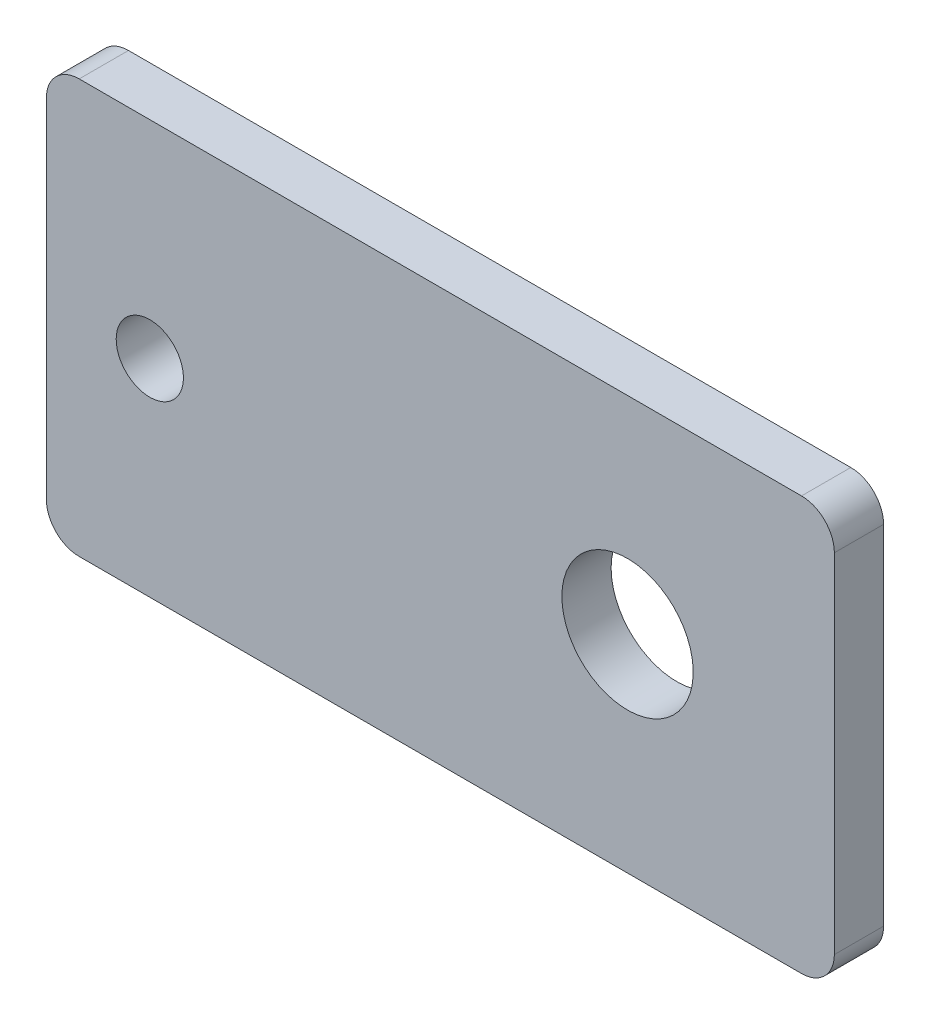
ISO-10303-21;
HEADER;
FILE_DESCRIPTION(('STEP AP214'),'2;1');
FILE_NAME('part.step','',(''),(''),'','','');
FILE_SCHEMA(('AUTOMOTIVE_DESIGN { 1 0 10303 214 1 1 1 1 }'));
ENDSEC;
DATA;
#1=APPLICATION_CONTEXT('core data for automotive mechanical design processes');
#2=APPLICATION_PROTOCOL_DEFINITION('international standard','automotive_design',2000,#1);
#3=PRODUCT_CONTEXT('',#1,'mechanical');
#4=PRODUCT('Part','Part','',(#3));
#5=PRODUCT_RELATED_PRODUCT_CATEGORY('part','',(#4));
#6=PRODUCT_DEFINITION_FORMATION('','',#4);
#7=PRODUCT_DEFINITION_CONTEXT('part definition',#1,'design');
#8=PRODUCT_DEFINITION('design','',#6,#7);
#9=PRODUCT_DEFINITION_SHAPE('','',#8);
#10=(LENGTH_UNIT() NAMED_UNIT(*) SI_UNIT(.MILLI.,.METRE.));
#11=(NAMED_UNIT(*) PLANE_ANGLE_UNIT() SI_UNIT($,.RADIAN.));
#12=(NAMED_UNIT(*) SI_UNIT($,.STERADIAN.) SOLID_ANGLE_UNIT());
#13=UNCERTAINTY_MEASURE_WITH_UNIT(LENGTH_MEASURE(1.E-05),#10,'distance_accuracy_value','');
#14=(GEOMETRIC_REPRESENTATION_CONTEXT(3) GLOBAL_UNCERTAINTY_ASSIGNED_CONTEXT((#13)) GLOBAL_UNIT_ASSIGNED_CONTEXT((#10,
#11,#12)) REPRESENTATION_CONTEXT('',''));
#15=CARTESIAN_POINT('',(0.,0.,0.));
#16=DIRECTION('',(0.,0.,1.));
#17=DIRECTION('',(1.,0.,0.));
#18=AXIS2_PLACEMENT_3D('',#15,#16,#17);
#19=CARTESIAN_POINT('',(0.,0.,4.7625));
#20=DIRECTION('',(0.,0.,1.));
#21=DIRECTION('',(1.,0.,0.));
#22=AXIS2_PLACEMENT_3D('',#19,#20,#21);
#23=PLANE('',#22);
#24=CARTESIAN_POINT('',(221.749963424788,-18.1000253637566,4.7625));
#25=DIRECTION('',(0.,0.,1.));
#26=DIRECTION('',(1.,0.,0.));
#27=AXIS2_PLACEMENT_3D('',#24,#25,#26);
#28=CIRCLE('',#27,6.35);
#29=CARTESIAN_POINT('',(215.399963424788,-18.1000253637566,4.7625));
#30=VERTEX_POINT('',#29);
#31=EDGE_CURVE('E174',#30,#30,#28,.T.);
#32=ORIENTED_EDGE('',*,*,#31,.F.);
#33=EDGE_LOOP('',(#32));
#34=FACE_BOUND('',#33,.T.);
#35=DIRECTION('',(-1.,0.,0.));
#36=VECTOR('',#35,1.);
#37=CARTESIAN_POINT('',(241.749963424788,1.89997463624341,4.7625));
#38=LINE('',#37,#36);
#39=CARTESIAN_POINT('',(238.574963424788,1.89997463624341,4.7625));
#40=VERTEX_POINT('',#39);
#41=CARTESIAN_POINT('',(168.724963424788,1.8999746362434,4.7625));
#42=VERTEX_POINT('',#41);
#43=EDGE_CURVE('E169',#40,#42,#38,.T.);
#44=ORIENTED_EDGE('',*,*,#43,.T.);
#45=CARTESIAN_POINT('',(168.724963424788,-1.2750253637566,4.7625));
#46=DIRECTION('',(0.,0.,1.));
#47=DIRECTION('',(1.,0.,0.));
#48=AXIS2_PLACEMENT_3D('',#45,#46,#47);
#49=CIRCLE('',#48,3.175);
#50=CARTESIAN_POINT('',(165.549963424788,-1.2750253637566,4.7625));
#51=VERTEX_POINT('',#50);
#52=EDGE_CURVE('E150',#42,#51,#49,.T.);
#53=ORIENTED_EDGE('',*,*,#52,.T.);
#54=DIRECTION('',(0.,-1.,0.));
#55=VECTOR('',#54,1.);
#56=CARTESIAN_POINT('',(165.549963424788,-38.1000253637566,4.7625));
#57=LINE('',#56,#55);
#58=CARTESIAN_POINT('',(165.549963424788,-34.9250253637566,4.7625));
#59=VERTEX_POINT('',#58);
#60=EDGE_CURVE('E120',#51,#59,#57,.T.);
#61=ORIENTED_EDGE('',*,*,#60,.T.);
#62=CARTESIAN_POINT('',(168.724963424788,-34.9250253637566,4.7625));
#63=DIRECTION('',(0.,0.,1.));
#64=DIRECTION('',(1.,0.,0.));
#65=AXIS2_PLACEMENT_3D('',#62,#63,#64);
#66=CIRCLE('',#65,3.175);
#67=CARTESIAN_POINT('',(168.724963424788,-38.1000253637566,4.7625));
#68=VERTEX_POINT('',#67);
#69=EDGE_CURVE('E56',#59,#68,#66,.T.);
#70=ORIENTED_EDGE('',*,*,#69,.T.);
#71=DIRECTION('',(1.,0.,0.));
#72=VECTOR('',#71,1.);
#73=CARTESIAN_POINT('',(241.749963424788,-38.1000253637566,4.7625));
#74=LINE('',#73,#72);
#75=CARTESIAN_POINT('',(238.574963424788,-38.1000253637566,4.7625));
#76=VERTEX_POINT('',#75);
#77=EDGE_CURVE('E136',#68,#76,#74,.T.);
#78=ORIENTED_EDGE('',*,*,#77,.T.);
#79=CARTESIAN_POINT('',(238.574963424788,-34.9250253637566,4.7625));
#80=DIRECTION('',(0.,0.,1.));
#81=DIRECTION('',(1.,0.,0.));
#82=AXIS2_PLACEMENT_3D('',#79,#80,#81);
#83=CIRCLE('',#82,3.175);
#84=CARTESIAN_POINT('',(241.749963424788,-34.9250253637566,4.7625));
#85=VERTEX_POINT('',#84);
#86=EDGE_CURVE('E147',#76,#85,#83,.T.);
#87=ORIENTED_EDGE('',*,*,#86,.T.);
#88=DIRECTION('',(0.,1.,0.));
#89=VECTOR('',#88,1.);
#90=CARTESIAN_POINT('',(241.749963424788,-38.1000253637566,4.7625));
#91=LINE('',#90,#89);
#92=CARTESIAN_POINT('',(241.749963424788,-1.27502536375659,4.7625));
#93=VERTEX_POINT('',#92);
#94=EDGE_CURVE('E130',#85,#93,#91,.T.);
#95=ORIENTED_EDGE('',*,*,#94,.T.);
#96=CARTESIAN_POINT('',(238.574963424788,-1.27502536375659,4.7625));
#97=DIRECTION('',(0.,0.,1.));
#98=DIRECTION('',(1.,0.,0.));
#99=AXIS2_PLACEMENT_3D('',#96,#97,#98);
#100=CIRCLE('',#99,3.175);
#101=EDGE_CURVE('E145',#93,#40,#100,.T.);
#102=ORIENTED_EDGE('',*,*,#101,.T.);
#103=EDGE_LOOP('',(#44,#53,#61,#70,#78,#87,#95,#102));
#104=FACE_BOUND('',#103,.T.);
#105=CARTESIAN_POINT('',(175.549963424788,-18.1000253637566,4.7625));
#106=DIRECTION('',(0.,0.,1.));
#107=DIRECTION('',(1.,0.,0.));
#108=AXIS2_PLACEMENT_3D('',#105,#106,#107);
#109=CIRCLE('',#108,3.25000000000001);
#110=CARTESIAN_POINT('',(172.299963424788,-18.1000253637566,4.7625));
#111=VERTEX_POINT('',#110);
#112=EDGE_CURVE('E183',#111,#111,#109,.T.);
#113=ORIENTED_EDGE('',*,*,#112,.F.);
#114=EDGE_LOOP('',(#113));
#115=FACE_BOUND('',#114,.T.);
#116=ADVANCED_FACE('F34',(#34,#104,#115),#23,.T.);
#117=CARTESIAN_POINT('',(0.,0.,0.));
#118=DIRECTION('',(0.,0.,1.));
#119=DIRECTION('',(1.,0.,0.));
#120=AXIS2_PLACEMENT_3D('',#117,#118,#119);
#121=PLANE('',#120);
#122=CARTESIAN_POINT('',(221.749963424788,-18.1000253637566,0.));
#123=DIRECTION('',(0.,0.,1.));
#124=DIRECTION('',(1.,0.,0.));
#125=AXIS2_PLACEMENT_3D('',#122,#123,#124);
#126=CIRCLE('',#125,6.35);
#127=CARTESIAN_POINT('',(215.399963424788,-18.1000253637566,0.));
#128=VERTEX_POINT('',#127);
#129=EDGE_CURVE('E176',#128,#128,#126,.T.);
#130=ORIENTED_EDGE('',*,*,#129,.T.);
#131=EDGE_LOOP('',(#130));
#132=FACE_BOUND('',#131,.T.);
#133=DIRECTION('',(0.,-1.,0.));
#134=VECTOR('',#133,1.);
#135=CARTESIAN_POINT('',(165.549963424788,-38.1000253637566,0.));
#136=LINE('',#135,#134);
#137=CARTESIAN_POINT('',(165.549963424788,-1.2750253637566,0.));
#138=VERTEX_POINT('',#137);
#139=CARTESIAN_POINT('',(165.549963424788,-34.9250253637566,0.));
#140=VERTEX_POINT('',#139);
#141=EDGE_CURVE('E118',#138,#140,#136,.T.);
#142=ORIENTED_EDGE('',*,*,#141,.F.);
#143=CARTESIAN_POINT('',(168.724963424788,-1.2750253637566,0.));
#144=DIRECTION('',(0.,0.,1.));
#145=DIRECTION('',(1.,0.,0.));
#146=AXIS2_PLACEMENT_3D('',#143,#144,#145);
#147=CIRCLE('',#146,3.175);
#148=CARTESIAN_POINT('',(168.724963424788,1.8999746362434,0.));
#149=VERTEX_POINT('',#148);
#150=EDGE_CURVE('E101',#138,#149,#147,.F.);
#151=ORIENTED_EDGE('',*,*,#150,.T.);
#152=DIRECTION('',(-1.,0.,0.));
#153=VECTOR('',#152,1.);
#154=CARTESIAN_POINT('',(241.749963424788,1.89997463624341,0.));
#155=LINE('',#154,#153);
#156=CARTESIAN_POINT('',(238.574963424788,1.89997463624341,0.));
#157=VERTEX_POINT('',#156);
#158=EDGE_CURVE('E128',#157,#149,#155,.T.);
#159=ORIENTED_EDGE('',*,*,#158,.F.);
#160=CARTESIAN_POINT('',(238.574963424788,-1.27502536375659,0.));
#161=DIRECTION('',(0.,0.,1.));
#162=DIRECTION('',(1.,0.,0.));
#163=AXIS2_PLACEMENT_3D('',#160,#161,#162);
#164=CIRCLE('',#163,3.175);
#165=CARTESIAN_POINT('',(241.749963424788,-1.27502536375659,0.));
#166=VERTEX_POINT('',#165);
#167=EDGE_CURVE('E121',#157,#166,#164,.F.);
#168=ORIENTED_EDGE('',*,*,#167,.T.);
#169=DIRECTION('',(0.,1.,0.));
#170=VECTOR('',#169,1.);
#171=CARTESIAN_POINT('',(241.749963424788,-38.1000253637566,0.));
#172=LINE('',#171,#170);
#173=CARTESIAN_POINT('',(241.749963424788,-34.9250253637566,0.));
#174=VERTEX_POINT('',#173);
#175=EDGE_CURVE('E132',#174,#166,#172,.T.);
#176=ORIENTED_EDGE('',*,*,#175,.F.);
#177=CARTESIAN_POINT('',(238.574963424788,-34.9250253637566,0.));
#178=DIRECTION('',(0.,0.,1.));
#179=DIRECTION('',(1.,0.,0.));
#180=AXIS2_PLACEMENT_3D('',#177,#178,#179);
#181=CIRCLE('',#180,3.175);
#182=CARTESIAN_POINT('',(238.574963424788,-38.1000253637566,0.));
#183=VERTEX_POINT('',#182);
#184=EDGE_CURVE('E139',#174,#183,#181,.F.);
#185=ORIENTED_EDGE('',*,*,#184,.T.);
#186=DIRECTION('',(1.,0.,0.));
#187=VECTOR('',#186,1.);
#188=CARTESIAN_POINT('',(241.749963424788,-38.1000253637566,0.));
#189=LINE('',#188,#187);
#190=CARTESIAN_POINT('',(168.724963424788,-38.1000253637566,0.));
#191=VERTEX_POINT('',#190);
#192=EDGE_CURVE('E127',#191,#183,#189,.T.);
#193=ORIENTED_EDGE('',*,*,#192,.F.);
#194=CARTESIAN_POINT('',(168.724963424788,-34.9250253637566,0.));
#195=DIRECTION('',(0.,0.,1.));
#196=DIRECTION('',(1.,0.,0.));
#197=AXIS2_PLACEMENT_3D('',#194,#195,#196);
#198=CIRCLE('',#197,3.175);
#199=EDGE_CURVE('E112',#191,#140,#198,.F.);
#200=ORIENTED_EDGE('',*,*,#199,.T.);
#201=EDGE_LOOP('',(#142,#151,#159,#168,#176,#185,#193,#200));
#202=FACE_BOUND('',#201,.T.);
#203=CARTESIAN_POINT('',(175.549963424788,-18.1000253637566,0.));
#204=DIRECTION('',(0.,0.,1.));
#205=DIRECTION('',(1.,0.,0.));
#206=AXIS2_PLACEMENT_3D('',#203,#204,#205);
#207=CIRCLE('',#206,3.25000000000001);
#208=CARTESIAN_POINT('',(172.299963424788,-18.1000253637566,0.));
#209=VERTEX_POINT('',#208);
#210=EDGE_CURVE('E185',#209,#209,#207,.T.);
#211=ORIENTED_EDGE('',*,*,#210,.T.);
#212=EDGE_LOOP('',(#211));
#213=FACE_BOUND('',#212,.T.);
#214=ADVANCED_FACE('F124',(#132,#202,#213),#121,.F.);
#215=CARTESIAN_POINT('',(241.749963424788,-38.1000253637566,4.7625));
#216=DIRECTION('',(-1.,0.,0.));
#217=DIRECTION('',(0.,0.,1.));
#218=AXIS2_PLACEMENT_3D('',#215,#216,#217);
#219=PLANE('',#218);
#220=ORIENTED_EDGE('',*,*,#94,.F.);
#221=DIRECTION('',(0.,0.,-1.));
#222=VECTOR('',#221,1.);
#223=CARTESIAN_POINT('',(241.749963424788,-34.9250253637566,4.7625));
#224=LINE('',#223,#222);
#225=EDGE_CURVE('E11',#85,#174,#224,.T.);
#226=ORIENTED_EDGE('',*,*,#225,.T.);
#227=ORIENTED_EDGE('',*,*,#175,.T.);
#228=DIRECTION('',(0.,0.,-1.));
#229=VECTOR('',#228,1.);
#230=CARTESIAN_POINT('',(241.749963424788,-1.27502536375659,4.7625));
#231=LINE('',#230,#229);
#232=EDGE_CURVE('E42',#166,#93,#231,.F.);
#233=ORIENTED_EDGE('',*,*,#232,.T.);
#234=EDGE_LOOP('',(#220,#226,#227,#233));
#235=FACE_BOUND('',#234,.T.);
#236=ADVANCED_FACE('F160',(#235),#219,.F.);
#237=CARTESIAN_POINT('',(241.749963424788,1.89997463624341,4.7625));
#238=DIRECTION('',(0.,-1.,0.));
#239=DIRECTION('',(1.,0.,0.));
#240=AXIS2_PLACEMENT_3D('',#237,#238,#239);
#241=PLANE('',#240);
#242=ORIENTED_EDGE('',*,*,#158,.T.);
#243=DIRECTION('',(0.,0.,-1.));
#244=VECTOR('',#243,1.);
#245=CARTESIAN_POINT('',(168.724963424788,1.8999746362434,4.7625));
#246=LINE('',#245,#244);
#247=EDGE_CURVE('E106',#149,#42,#246,.F.);
#248=ORIENTED_EDGE('',*,*,#247,.T.);
#249=ORIENTED_EDGE('',*,*,#43,.F.);
#250=DIRECTION('',(0.,0.,-1.));
#251=VECTOR('',#250,1.);
#252=CARTESIAN_POINT('',(238.574963424788,1.89997463624341,4.7625));
#253=LINE('',#252,#251);
#254=EDGE_CURVE('E111',#40,#157,#253,.T.);
#255=ORIENTED_EDGE('',*,*,#254,.T.);
#256=EDGE_LOOP('',(#242,#248,#249,#255));
#257=FACE_BOUND('',#256,.T.);
#258=ADVANCED_FACE('F173',(#257),#241,.F.);
#259=CARTESIAN_POINT('',(165.549963424788,-38.1000253637566,4.7625));
#260=DIRECTION('',(1.,0.,0.));
#261=DIRECTION('',(0.,0.,-1.));
#262=AXIS2_PLACEMENT_3D('',#259,#260,#261);
#263=PLANE('',#262);
#264=ORIENTED_EDGE('',*,*,#60,.F.);
#265=DIRECTION('',(0.,0.,-1.));
#266=VECTOR('',#265,1.);
#267=CARTESIAN_POINT('',(165.549963424788,-1.2750253637566,4.7625));
#268=LINE('',#267,#266);
#269=EDGE_CURVE('E105',#51,#138,#268,.T.);
#270=ORIENTED_EDGE('',*,*,#269,.T.);
#271=ORIENTED_EDGE('',*,*,#141,.T.);
#272=DIRECTION('',(0.,0.,-1.));
#273=VECTOR('',#272,1.);
#274=CARTESIAN_POINT('',(165.549963424788,-34.9250253637566,4.7625));
#275=LINE('',#274,#273);
#276=EDGE_CURVE('E122',#140,#59,#275,.F.);
#277=ORIENTED_EDGE('',*,*,#276,.T.);
#278=EDGE_LOOP('',(#264,#270,#271,#277));
#279=FACE_BOUND('',#278,.T.);
#280=ADVANCED_FACE('F117',(#279),#263,.F.);
#281=CARTESIAN_POINT('',(241.749963424788,-38.1000253637566,4.7625));
#282=DIRECTION('',(0.,1.,0.));
#283=DIRECTION('',(-1.,0.,0.));
#284=AXIS2_PLACEMENT_3D('',#281,#282,#283);
#285=PLANE('',#284);
#286=ORIENTED_EDGE('',*,*,#77,.F.);
#287=DIRECTION('',(0.,0.,-1.));
#288=VECTOR('',#287,1.);
#289=CARTESIAN_POINT('',(168.724963424788,-38.1000253637566,4.7625));
#290=LINE('',#289,#288);
#291=EDGE_CURVE('E153',#68,#191,#290,.T.);
#292=ORIENTED_EDGE('',*,*,#291,.T.);
#293=ORIENTED_EDGE('',*,*,#192,.T.);
#294=DIRECTION('',(0.,0.,-1.));
#295=VECTOR('',#294,1.);
#296=CARTESIAN_POINT('',(238.574963424788,-38.1000253637566,4.7625));
#297=LINE('',#296,#295);
#298=EDGE_CURVE('E49',#183,#76,#297,.F.);
#299=ORIENTED_EDGE('',*,*,#298,.T.);
#300=EDGE_LOOP('',(#286,#292,#293,#299));
#301=FACE_BOUND('',#300,.T.);
#302=ADVANCED_FACE('F206',(#301),#285,.F.);
#303=CARTESIAN_POINT('',(221.749963424788,-18.1000253637566,4.7625));
#304=DIRECTION('',(0.,0.,-1.));
#305=DIRECTION('',(-1.,0.,0.));
#306=AXIS2_PLACEMENT_3D('',#303,#304,#305);
#307=CYLINDRICAL_SURFACE('',#306,6.35);
#308=CARTESIAN_POINT('',(215.399963424788,-18.1000253637566,4.7625));
#309=CARTESIAN_POINT('',(215.399963424788,-18.1000253637566,4.712890625));
#310=CARTESIAN_POINT('',(215.399963424788,-18.1000253637566,4.66328125));
#311=CARTESIAN_POINT('',(215.399963424788,-18.1000253637566,4.5640625));
#312=CARTESIAN_POINT('',(215.399963424788,-18.1000253637566,4.514453125));
#313=CARTESIAN_POINT('',(215.399963424788,-18.1000253637566,4.415234375));
#314=CARTESIAN_POINT('',(215.399963424788,-18.1000253637566,4.365625));
#315=CARTESIAN_POINT('',(215.399963424788,-18.1000253637566,4.26640625));
#316=CARTESIAN_POINT('',(215.399963424788,-18.1000253637566,4.216796875));
#317=CARTESIAN_POINT('',(215.399963424788,-18.1000253637566,4.117578125));
#318=CARTESIAN_POINT('',(215.399963424788,-18.1000253637566,4.06796875));
#319=CARTESIAN_POINT('',(215.399963424788,-18.1000253637566,3.96875));
#320=CARTESIAN_POINT('',(215.399963424788,-18.1000253637566,3.919140625));
#321=CARTESIAN_POINT('',(215.399963424788,-18.1000253637566,3.819921875));
#322=CARTESIAN_POINT('',(215.399963424788,-18.1000253637566,3.7703125));
#323=CARTESIAN_POINT('',(215.399963424788,-18.1000253637566,3.67109375));
#324=CARTESIAN_POINT('',(215.399963424788,-18.1000253637566,3.621484375));
#325=CARTESIAN_POINT('',(215.399963424788,-18.1000253637566,3.522265625));
#326=CARTESIAN_POINT('',(215.399963424788,-18.1000253637566,3.47265625));
#327=CARTESIAN_POINT('',(215.399963424788,-18.1000253637566,3.3734375));
#328=CARTESIAN_POINT('',(215.399963424788,-18.1000253637566,3.323828125));
#329=CARTESIAN_POINT('',(215.399963424788,-18.1000253637566,3.224609375));
#330=CARTESIAN_POINT('',(215.399963424788,-18.1000253637566,3.175));
#331=CARTESIAN_POINT('',(215.399963424788,-18.1000253637566,3.07578125));
#332=CARTESIAN_POINT('',(215.399963424788,-18.1000253637566,3.026171875));
#333=CARTESIAN_POINT('',(215.399963424788,-18.1000253637566,2.926953125));
#334=CARTESIAN_POINT('',(215.399963424788,-18.1000253637566,2.87734375));
#335=CARTESIAN_POINT('',(215.399963424788,-18.1000253637566,2.778125));
#336=CARTESIAN_POINT('',(215.399963424788,-18.1000253637566,2.728515625));
#337=CARTESIAN_POINT('',(215.399963424788,-18.1000253637566,2.629296875));
#338=CARTESIAN_POINT('',(215.399963424788,-18.1000253637566,2.5796875));
#339=CARTESIAN_POINT('',(215.399963424788,-18.1000253637566,2.48046875));
#340=CARTESIAN_POINT('',(215.399963424788,-18.1000253637566,2.430859375));
#341=CARTESIAN_POINT('',(215.399963424788,-18.1000253637566,2.331640625));
#342=CARTESIAN_POINT('',(215.399963424788,-18.1000253637566,2.28203125));
#343=CARTESIAN_POINT('',(215.399963424788,-18.1000253637566,2.1828125));
#344=CARTESIAN_POINT('',(215.399963424788,-18.1000253637566,2.133203125));
#345=CARTESIAN_POINT('',(215.399963424788,-18.1000253637566,2.033984375));
#346=CARTESIAN_POINT('',(215.399963424788,-18.1000253637566,1.984375));
#347=CARTESIAN_POINT('',(215.399963424788,-18.1000253637566,1.88515625));
#348=CARTESIAN_POINT('',(215.399963424788,-18.1000253637566,1.835546875));
#349=CARTESIAN_POINT('',(215.399963424788,-18.1000253637566,1.736328125));
#350=CARTESIAN_POINT('',(215.399963424788,-18.1000253637566,1.68671875));
#351=CARTESIAN_POINT('',(215.399963424788,-18.1000253637566,1.5875));
#352=CARTESIAN_POINT('',(215.399963424788,-18.1000253637566,1.537890625));
#353=CARTESIAN_POINT('',(215.399963424788,-18.1000253637566,1.438671875));
#354=CARTESIAN_POINT('',(215.399963424788,-18.1000253637566,1.3890625));
#355=CARTESIAN_POINT('',(215.399963424788,-18.1000253637566,1.28984375));
#356=CARTESIAN_POINT('',(215.399963424788,-18.1000253637566,1.240234375));
#357=CARTESIAN_POINT('',(215.399963424788,-18.1000253637566,1.141015625));
#358=CARTESIAN_POINT('',(215.399963424788,-18.1000253637566,1.09140625));
#359=CARTESIAN_POINT('',(215.399963424788,-18.1000253637566,0.992187499999999));
#360=CARTESIAN_POINT('',(215.399963424788,-18.1000253637566,0.942578124999999));
#361=CARTESIAN_POINT('',(215.399963424788,-18.1000253637566,0.843359375));
#362=CARTESIAN_POINT('',(215.399963424788,-18.1000253637566,0.79375));
#363=CARTESIAN_POINT('',(215.399963424788,-18.1000253637566,0.69453125));
#364=CARTESIAN_POINT('',(215.399963424788,-18.1000253637566,0.644921875));
#365=CARTESIAN_POINT('',(215.399963424788,-18.1000253637566,0.545703125));
#366=CARTESIAN_POINT('',(215.399963424788,-18.1000253637566,0.49609375));
#367=CARTESIAN_POINT('',(215.399963424788,-18.1000253637566,0.396875));
#368=CARTESIAN_POINT('',(215.399963424788,-18.1000253637566,0.347265625));
#369=CARTESIAN_POINT('',(215.399963424788,-18.1000253637566,0.248046875));
#370=CARTESIAN_POINT('',(215.399963424788,-18.1000253637566,0.1984375));
#371=CARTESIAN_POINT('',(215.399963424788,-18.1000253637566,0.09921875));
#372=CARTESIAN_POINT('',(215.399963424788,-18.1000253637566,0.049609375));
#373=CARTESIAN_POINT('',(215.399963424788,-18.1000253637566,0.));
#374=B_SPLINE_CURVE_WITH_KNOTS('',3,(#308,#309,#310,#311,#312,#313,#314,#315,#316,#317,#318,
#319,#320,#321,#322,#323,#324,#325,#326,#327,#328,#329,#330,#331,#332,#333,#334,#335,#336,#337,
#338,#339,#340,#341,#342,#343,#344,#345,#346,#347,#348,#349,#350,#351,#352,#353,#354,#355,#356,
#357,#358,#359,#360,#361,#362,#363,#364,#365,#366,#367,#368,#369,#370,#371,#372,#373),
.UNSPECIFIED.,.F.,.F.,(4,2,2,2,2,2,2,2,2,2,2,2,2,2,2,2,2,2,2,2,2,2,2,2,2,2,2,2,2,2,2,2,4),(0.,
0.148828125,0.29765625,0.446484375,0.5953125,0.744140625,0.892968750000001,1.041796875,1.190625,
1.339453125,1.48828125,1.637109375,1.7859375,1.934765625,2.08359375,2.232421875,2.38125,
2.530078125,2.67890625,2.827734375,2.9765625,3.125390625,3.27421875,3.423046875,3.571875,
3.720703125,3.86953125,4.018359375,4.1671875,4.316015625,4.46484375,4.613671875,4.7625),.UNSPECIFIED.);
#375=EDGE_CURVE('BSEAM203',#30,#128,#374,.T.);
#376=ORIENTED_EDGE('',*,*,#31,.T.);
#377=ORIENTED_EDGE('',*,*,#129,.F.);
#378=ORIENTED_EDGE('',*,*,#375,.T.);
#379=ORIENTED_EDGE('',*,*,#375,.F.);
#380=EDGE_LOOP('',(#376,#378,#377,#379));
#381=FACE_BOUND('',#380,.T.);
#382=ADVANCED_FACE('F203',(#381),#307,.F.);
#383=CARTESIAN_POINT('',(175.549963424788,-18.1000253637566,4.7625));
#384=DIRECTION('',(0.,0.,-1.));
#385=DIRECTION('',(-1.,0.,0.));
#386=AXIS2_PLACEMENT_3D('',#383,#384,#385);
#387=CYLINDRICAL_SURFACE('',#386,3.25000000000001);
#388=CARTESIAN_POINT('',(172.299963424788,-18.1000253637566,4.7625));
#389=CARTESIAN_POINT('',(172.299963424788,-18.1000253637566,4.712890625));
#390=CARTESIAN_POINT('',(172.299963424788,-18.1000253637566,4.66328125));
#391=CARTESIAN_POINT('',(172.299963424788,-18.1000253637566,4.5640625));
#392=CARTESIAN_POINT('',(172.299963424788,-18.1000253637566,4.514453125));
#393=CARTESIAN_POINT('',(172.299963424788,-18.1000253637566,4.415234375));
#394=CARTESIAN_POINT('',(172.299963424788,-18.1000253637566,4.365625));
#395=CARTESIAN_POINT('',(172.299963424788,-18.1000253637566,4.26640625));
#396=CARTESIAN_POINT('',(172.299963424788,-18.1000253637566,4.216796875));
#397=CARTESIAN_POINT('',(172.299963424788,-18.1000253637566,4.117578125));
#398=CARTESIAN_POINT('',(172.299963424788,-18.1000253637566,4.06796875));
#399=CARTESIAN_POINT('',(172.299963424788,-18.1000253637566,3.96875));
#400=CARTESIAN_POINT('',(172.299963424788,-18.1000253637566,3.919140625));
#401=CARTESIAN_POINT('',(172.299963424788,-18.1000253637566,3.819921875));
#402=CARTESIAN_POINT('',(172.299963424788,-18.1000253637566,3.7703125));
#403=CARTESIAN_POINT('',(172.299963424788,-18.1000253637566,3.67109375));
#404=CARTESIAN_POINT('',(172.299963424788,-18.1000253637566,3.621484375));
#405=CARTESIAN_POINT('',(172.299963424788,-18.1000253637566,3.522265625));
#406=CARTESIAN_POINT('',(172.299963424788,-18.1000253637566,3.47265625));
#407=CARTESIAN_POINT('',(172.299963424788,-18.1000253637566,3.3734375));
#408=CARTESIAN_POINT('',(172.299963424788,-18.1000253637566,3.323828125));
#409=CARTESIAN_POINT('',(172.299963424788,-18.1000253637566,3.224609375));
#410=CARTESIAN_POINT('',(172.299963424788,-18.1000253637566,3.175));
#411=CARTESIAN_POINT('',(172.299963424788,-18.1000253637566,3.07578125));
#412=CARTESIAN_POINT('',(172.299963424788,-18.1000253637566,3.026171875));
#413=CARTESIAN_POINT('',(172.299963424788,-18.1000253637566,2.926953125));
#414=CARTESIAN_POINT('',(172.299963424788,-18.1000253637566,2.87734375));
#415=CARTESIAN_POINT('',(172.299963424788,-18.1000253637566,2.778125));
#416=CARTESIAN_POINT('',(172.299963424788,-18.1000253637566,2.728515625));
#417=CARTESIAN_POINT('',(172.299963424788,-18.1000253637566,2.629296875));
#418=CARTESIAN_POINT('',(172.299963424788,-18.1000253637566,2.5796875));
#419=CARTESIAN_POINT('',(172.299963424788,-18.1000253637566,2.48046875));
#420=CARTESIAN_POINT('',(172.299963424788,-18.1000253637566,2.430859375));
#421=CARTESIAN_POINT('',(172.299963424788,-18.1000253637566,2.331640625));
#422=CARTESIAN_POINT('',(172.299963424788,-18.1000253637566,2.28203125));
#423=CARTESIAN_POINT('',(172.299963424788,-18.1000253637566,2.1828125));
#424=CARTESIAN_POINT('',(172.299963424788,-18.1000253637566,2.133203125));
#425=CARTESIAN_POINT('',(172.299963424788,-18.1000253637566,2.033984375));
#426=CARTESIAN_POINT('',(172.299963424788,-18.1000253637566,1.984375));
#427=CARTESIAN_POINT('',(172.299963424788,-18.1000253637566,1.88515625));
#428=CARTESIAN_POINT('',(172.299963424788,-18.1000253637566,1.835546875));
#429=CARTESIAN_POINT('',(172.299963424788,-18.1000253637566,1.736328125));
#430=CARTESIAN_POINT('',(172.299963424788,-18.1000253637566,1.68671875));
#431=CARTESIAN_POINT('',(172.299963424788,-18.1000253637566,1.5875));
#432=CARTESIAN_POINT('',(172.299963424788,-18.1000253637566,1.537890625));
#433=CARTESIAN_POINT('',(172.299963424788,-18.1000253637566,1.438671875));
#434=CARTESIAN_POINT('',(172.299963424788,-18.1000253637566,1.3890625));
#435=CARTESIAN_POINT('',(172.299963424788,-18.1000253637566,1.28984375));
#436=CARTESIAN_POINT('',(172.299963424788,-18.1000253637566,1.240234375));
#437=CARTESIAN_POINT('',(172.299963424788,-18.1000253637566,1.141015625));
#438=CARTESIAN_POINT('',(172.299963424788,-18.1000253637566,1.09140625));
#439=CARTESIAN_POINT('',(172.299963424788,-18.1000253637566,0.9921875));
#440=CARTESIAN_POINT('',(172.299963424788,-18.1000253637566,0.942578125));
#441=CARTESIAN_POINT('',(172.299963424788,-18.1000253637566,0.843359375));
#442=CARTESIAN_POINT('',(172.299963424788,-18.1000253637566,0.79375));
#443=CARTESIAN_POINT('',(172.299963424788,-18.1000253637566,0.69453125));
#444=CARTESIAN_POINT('',(172.299963424788,-18.1000253637566,0.644921875));
#445=CARTESIAN_POINT('',(172.299963424788,-18.1000253637566,0.545703125));
#446=CARTESIAN_POINT('',(172.299963424788,-18.1000253637566,0.49609375));
#447=CARTESIAN_POINT('',(172.299963424788,-18.1000253637566,0.396875));
#448=CARTESIAN_POINT('',(172.299963424788,-18.1000253637566,0.347265625));
#449=CARTESIAN_POINT('',(172.299963424788,-18.1000253637566,0.248046875));
#450=CARTESIAN_POINT('',(172.299963424788,-18.1000253637566,0.1984375));
#451=CARTESIAN_POINT('',(172.299963424788,-18.1000253637566,0.09921875));
#452=CARTESIAN_POINT('',(172.299963424788,-18.1000253637566,0.049609375));
#453=CARTESIAN_POINT('',(172.299963424788,-18.1000253637566,0.));
#454=B_SPLINE_CURVE_WITH_KNOTS('',3,(#388,#389,#390,#391,#392,#393,#394,#395,#396,#397,#398,
#399,#400,#401,#402,#403,#404,#405,#406,#407,#408,#409,#410,#411,#412,#413,#414,#415,#416,#417,
#418,#419,#420,#421,#422,#423,#424,#425,#426,#427,#428,#429,#430,#431,#432,#433,#434,#435,#436,
#437,#438,#439,#440,#441,#442,#443,#444,#445,#446,#447,#448,#449,#450,#451,#452,#453),
.UNSPECIFIED.,.F.,.F.,(4,2,2,2,2,2,2,2,2,2,2,2,2,2,2,2,2,2,2,2,2,2,2,2,2,2,2,2,2,2,2,2,4),(0.,
0.148828124999999,0.297656249999999,0.446484374999999,0.595312499999999,0.744140625,0.89296875,
1.041796875,1.190625,1.339453125,1.48828125,1.637109375,1.7859375,1.934765625,2.08359375,
2.232421875,2.38125,2.530078125,2.67890625,2.827734375,2.9765625,3.125390625,3.27421875,
3.423046875,3.571875,3.720703125,3.86953125,4.018359375,4.1671875,4.316015625,4.46484375,
4.613671875,4.7625),.UNSPECIFIED.);
#455=EDGE_CURVE('BSEAM191',#111,#209,#454,.T.);
#456=ORIENTED_EDGE('',*,*,#112,.T.);
#457=ORIENTED_EDGE('',*,*,#210,.F.);
#458=ORIENTED_EDGE('',*,*,#455,.T.);
#459=ORIENTED_EDGE('',*,*,#455,.F.);
#460=EDGE_LOOP('',(#456,#458,#457,#459));
#461=FACE_BOUND('',#460,.T.);
#462=ADVANCED_FACE('F191',(#461),#387,.F.);
#463=CARTESIAN_POINT('',(168.724963424788,-1.2750253637566,4.7625));
#464=DIRECTION('',(0.,0.,-1.));
#465=DIRECTION('',(-1.,0.,0.));
#466=AXIS2_PLACEMENT_3D('',#463,#464,#465);
#467=CYLINDRICAL_SURFACE('',#466,3.175);
#468=ORIENTED_EDGE('',*,*,#52,.F.);
#469=ORIENTED_EDGE('',*,*,#247,.F.);
#470=ORIENTED_EDGE('',*,*,#150,.F.);
#471=ORIENTED_EDGE('',*,*,#269,.F.);
#472=EDGE_LOOP('',(#468,#469,#470,#471));
#473=FACE_BOUND('',#472,.T.);
#474=ADVANCED_FACE('F104',(#473),#467,.T.);
#475=CARTESIAN_POINT('',(168.724963424788,-34.9250253637566,4.7625));
#476=DIRECTION('',(0.,0.,-1.));
#477=DIRECTION('',(-1.,0.,0.));
#478=AXIS2_PLACEMENT_3D('',#475,#476,#477);
#479=CYLINDRICAL_SURFACE('',#478,3.175);
#480=ORIENTED_EDGE('',*,*,#69,.F.);
#481=ORIENTED_EDGE('',*,*,#276,.F.);
#482=ORIENTED_EDGE('',*,*,#199,.F.);
#483=ORIENTED_EDGE('',*,*,#291,.F.);
#484=EDGE_LOOP('',(#480,#481,#482,#483));
#485=FACE_BOUND('',#484,.T.);
#486=ADVANCED_FACE('F217',(#485),#479,.T.);
#487=CARTESIAN_POINT('',(238.574963424788,-34.9250253637566,4.7625));
#488=DIRECTION('',(0.,0.,-1.));
#489=DIRECTION('',(-1.,0.,0.));
#490=AXIS2_PLACEMENT_3D('',#487,#488,#489);
#491=CYLINDRICAL_SURFACE('',#490,3.175);
#492=ORIENTED_EDGE('',*,*,#86,.F.);
#493=ORIENTED_EDGE('',*,*,#298,.F.);
#494=ORIENTED_EDGE('',*,*,#184,.F.);
#495=ORIENTED_EDGE('',*,*,#225,.F.);
#496=EDGE_LOOP('',(#492,#493,#494,#495));
#497=FACE_BOUND('',#496,.T.);
#498=ADVANCED_FACE('F219',(#497),#491,.T.);
#499=CARTESIAN_POINT('',(238.574963424788,-1.27502536375659,4.7625));
#500=DIRECTION('',(0.,0.,-1.));
#501=DIRECTION('',(-1.,0.,0.));
#502=AXIS2_PLACEMENT_3D('',#499,#500,#501);
#503=CYLINDRICAL_SURFACE('',#502,3.175);
#504=ORIENTED_EDGE('',*,*,#101,.F.);
#505=ORIENTED_EDGE('',*,*,#232,.F.);
#506=ORIENTED_EDGE('',*,*,#167,.F.);
#507=ORIENTED_EDGE('',*,*,#254,.F.);
#508=EDGE_LOOP('',(#504,#505,#506,#507));
#509=FACE_BOUND('',#508,.T.);
#510=ADVANCED_FACE('F36',(#509),#503,.T.);
#511=CLOSED_SHELL('',(#116,#214,#236,#258,#280,#302,#382,#462,#474,#486,#498,#510));
#512=MANIFOLD_SOLID_BREP('B2',#511);
#513=ADVANCED_BREP_SHAPE_REPRESENTATION('',(#18,#512),#14);
#514=SHAPE_DEFINITION_REPRESENTATION(#9,#513);
ENDSEC;
END-ISO-10303-21;
